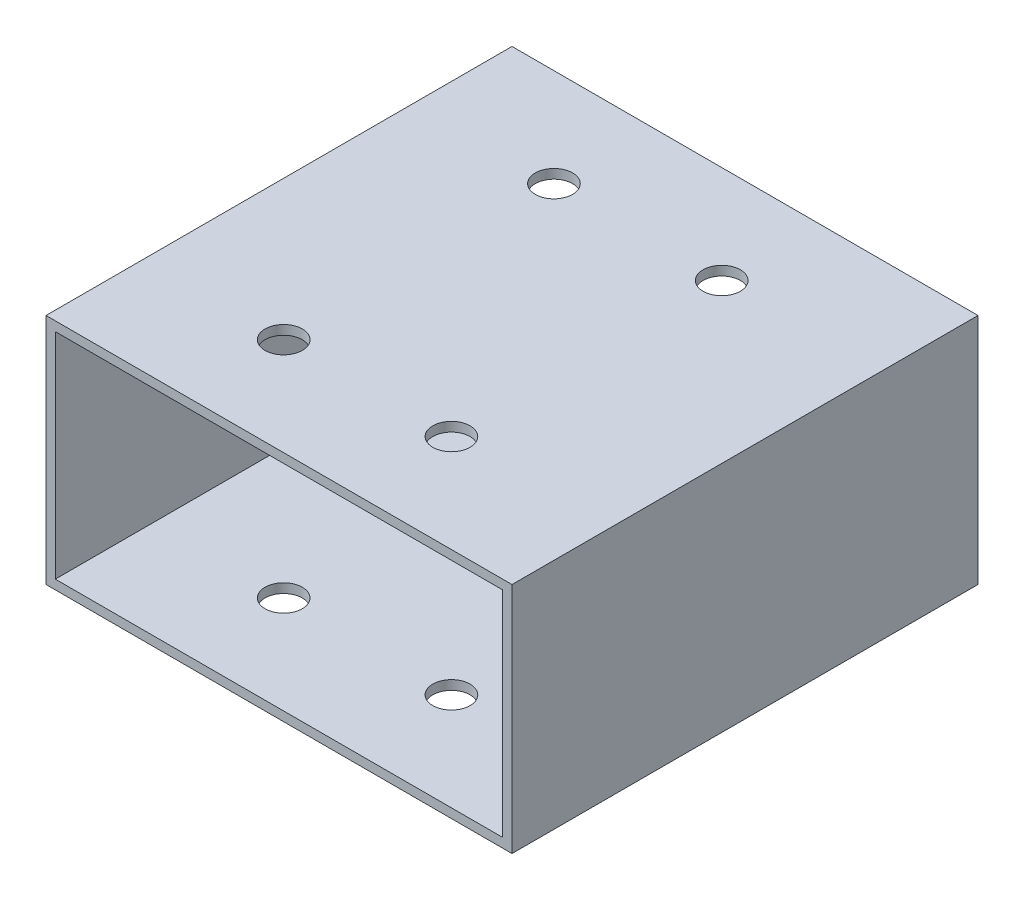
ISO-10303-21;
HEADER;
FILE_DESCRIPTION(('STEP AP214'),'2;1');
FILE_NAME('part.step','',(''),(''),'','','');
FILE_SCHEMA(('AUTOMOTIVE_DESIGN { 1 0 10303 214 1 1 1 1 }'));
ENDSEC;
DATA;
#1=APPLICATION_CONTEXT('core data for automotive mechanical design processes');
#2=APPLICATION_PROTOCOL_DEFINITION('international standard','automotive_design',2000,#1);
#3=PRODUCT_CONTEXT('',#1,'mechanical');
#4=PRODUCT('Part','Part','',(#3));
#5=PRODUCT_RELATED_PRODUCT_CATEGORY('part','',(#4));
#6=PRODUCT_DEFINITION_FORMATION('','',#4);
#7=PRODUCT_DEFINITION_CONTEXT('part definition',#1,'design');
#8=PRODUCT_DEFINITION('design','',#6,#7);
#9=PRODUCT_DEFINITION_SHAPE('','',#8);
#10=(LENGTH_UNIT() NAMED_UNIT(*) SI_UNIT(.MILLI.,.METRE.));
#11=(NAMED_UNIT(*) PLANE_ANGLE_UNIT() SI_UNIT($,.RADIAN.));
#12=(NAMED_UNIT(*) SI_UNIT($,.STERADIAN.) SOLID_ANGLE_UNIT());
#13=UNCERTAINTY_MEASURE_WITH_UNIT(LENGTH_MEASURE(1.E-05),#10,'distance_accuracy_value','');
#14=(GEOMETRIC_REPRESENTATION_CONTEXT(3) GLOBAL_UNCERTAINTY_ASSIGNED_CONTEXT((#13)) GLOBAL_UNIT_ASSIGNED_CONTEXT((#10,
#11,#12)) REPRESENTATION_CONTEXT('',''));
#15=CARTESIAN_POINT('',(0.,0.,0.));
#16=DIRECTION('',(0.,0.,1.));
#17=DIRECTION('',(1.,0.,0.));
#18=AXIS2_PLACEMENT_3D('',#15,#16,#17);
#19=CARTESIAN_POINT('',(0.,0.,50.));
#20=DIRECTION('',(0.,0.,-1.));
#21=DIRECTION('',(-1.,0.,0.));
#22=AXIS2_PLACEMENT_3D('',#19,#20,#21);
#23=PLANE('',#22);
#24=DIRECTION('',(0.,-1.,0.));
#25=VECTOR('',#24,1.);
#26=CARTESIAN_POINT('',(0.,0.,50.));
#27=LINE('',#26,#25);
#28=CARTESIAN_POINT('',(0.,25.,50.));
#29=VERTEX_POINT('',#28);
#30=CARTESIAN_POINT('',(0.,0.,50.));
#31=VERTEX_POINT('',#30);
#32=EDGE_CURVE('E158',#29,#31,#27,.T.);
#33=ORIENTED_EDGE('',*,*,#32,.T.);
#34=DIRECTION('',(1.,0.,0.));
#35=VECTOR('',#34,1.);
#36=CARTESIAN_POINT('',(0.,0.,50.));
#37=LINE('',#36,#35);
#38=CARTESIAN_POINT('',(50.,0.,50.));
#39=VERTEX_POINT('',#38);
#40=EDGE_CURVE('E162',#31,#39,#37,.T.);
#41=ORIENTED_EDGE('',*,*,#40,.T.);
#42=DIRECTION('',(0.,1.,0.));
#43=VECTOR('',#42,1.);
#44=CARTESIAN_POINT('',(50.,0.,50.));
#45=LINE('',#44,#43);
#46=CARTESIAN_POINT('',(50.,25.,50.));
#47=VERTEX_POINT('',#46);
#48=EDGE_CURVE('E166',#39,#47,#45,.T.);
#49=ORIENTED_EDGE('',*,*,#48,.T.);
#50=DIRECTION('',(-1.,0.,0.));
#51=VECTOR('',#50,1.);
#52=CARTESIAN_POINT('',(0.,25.,50.));
#53=LINE('',#52,#51);
#54=EDGE_CURVE('E169',#47,#29,#53,.T.);
#55=ORIENTED_EDGE('',*,*,#54,.T.);
#56=EDGE_LOOP('',(#33,#41,#49,#55));
#57=FACE_BOUND('',#56,.T.);
#58=DIRECTION('',(0.,-1.,0.));
#59=VECTOR('',#58,1.);
#60=CARTESIAN_POINT('',(1.,1.,50.));
#61=LINE('',#60,#59);
#62=CARTESIAN_POINT('',(1.,24.,50.));
#63=VERTEX_POINT('',#62);
#64=CARTESIAN_POINT('',(1.,1.,50.));
#65=VERTEX_POINT('',#64);
#66=EDGE_CURVE('E107',#63,#65,#61,.T.);
#67=ORIENTED_EDGE('',*,*,#66,.F.);
#68=DIRECTION('',(-1.,0.,0.));
#69=VECTOR('',#68,1.);
#70=CARTESIAN_POINT('',(1.,24.,50.));
#71=LINE('',#70,#69);
#72=CARTESIAN_POINT('',(49.,24.,50.));
#73=VERTEX_POINT('',#72);
#74=EDGE_CURVE('E135',#73,#63,#71,.T.);
#75=ORIENTED_EDGE('',*,*,#74,.F.);
#76=DIRECTION('',(0.,1.,0.));
#77=VECTOR('',#76,1.);
#78=CARTESIAN_POINT('',(49.,1.,50.));
#79=LINE('',#78,#77);
#80=CARTESIAN_POINT('',(49.,1.,50.));
#81=VERTEX_POINT('',#80);
#82=EDGE_CURVE('E129',#81,#73,#79,.T.);
#83=ORIENTED_EDGE('',*,*,#82,.F.);
#84=DIRECTION('',(1.,0.,0.));
#85=VECTOR('',#84,1.);
#86=CARTESIAN_POINT('',(1.,1.,50.));
#87=LINE('',#86,#85);
#88=EDGE_CURVE('E116',#65,#81,#87,.T.);
#89=ORIENTED_EDGE('',*,*,#88,.F.);
#90=EDGE_LOOP('',(#67,#75,#83,#89));
#91=FACE_BOUND('',#90,.T.);
#92=ADVANCED_FACE('F39',(#57,#91),#23,.F.);
#93=CARTESIAN_POINT('',(0.,0.,0.));
#94=DIRECTION('',(0.,0.,-1.));
#95=DIRECTION('',(-1.,0.,0.));
#96=AXIS2_PLACEMENT_3D('',#93,#94,#95);
#97=PLANE('',#96);
#98=DIRECTION('',(0.,-1.,0.));
#99=VECTOR('',#98,1.);
#100=CARTESIAN_POINT('',(0.,0.,0.));
#101=LINE('',#100,#99);
#102=CARTESIAN_POINT('',(0.,25.,0.));
#103=VERTEX_POINT('',#102);
#104=CARTESIAN_POINT('',(0.,0.,0.));
#105=VERTEX_POINT('',#104);
#106=EDGE_CURVE('E125',#103,#105,#101,.T.);
#107=ORIENTED_EDGE('',*,*,#106,.F.);
#108=DIRECTION('',(-1.,0.,0.));
#109=VECTOR('',#108,1.);
#110=CARTESIAN_POINT('',(0.,25.,0.));
#111=LINE('',#110,#109);
#112=CARTESIAN_POINT('',(50.,25.,0.));
#113=VERTEX_POINT('',#112);
#114=EDGE_CURVE('E163',#113,#103,#111,.T.);
#115=ORIENTED_EDGE('',*,*,#114,.F.);
#116=DIRECTION('',(0.,1.,0.));
#117=VECTOR('',#116,1.);
#118=CARTESIAN_POINT('',(50.,0.,0.));
#119=LINE('',#118,#117);
#120=CARTESIAN_POINT('',(50.,0.,0.));
#121=VERTEX_POINT('',#120);
#122=EDGE_CURVE('E179',#121,#113,#119,.T.);
#123=ORIENTED_EDGE('',*,*,#122,.F.);
#124=DIRECTION('',(1.,0.,0.));
#125=VECTOR('',#124,1.);
#126=CARTESIAN_POINT('',(0.,0.,0.));
#127=LINE('',#126,#125);
#128=EDGE_CURVE('E176',#105,#121,#127,.T.);
#129=ORIENTED_EDGE('',*,*,#128,.F.);
#130=EDGE_LOOP('',(#107,#115,#123,#129));
#131=FACE_BOUND('',#130,.T.);
#132=DIRECTION('',(-1.,0.,0.));
#133=VECTOR('',#132,1.);
#134=CARTESIAN_POINT('',(1.,24.,0.));
#135=LINE('',#134,#133);
#136=CARTESIAN_POINT('',(49.,24.,0.));
#137=VERTEX_POINT('',#136);
#138=CARTESIAN_POINT('',(1.,24.,0.));
#139=VERTEX_POINT('',#138);
#140=EDGE_CURVE('E117',#137,#139,#135,.T.);
#141=ORIENTED_EDGE('',*,*,#140,.T.);
#142=DIRECTION('',(0.,-1.,0.));
#143=VECTOR('',#142,1.);
#144=CARTESIAN_POINT('',(1.,1.,0.));
#145=LINE('',#144,#143);
#146=CARTESIAN_POINT('',(1.,1.,0.));
#147=VERTEX_POINT('',#146);
#148=EDGE_CURVE('E65',#139,#147,#145,.T.);
#149=ORIENTED_EDGE('',*,*,#148,.T.);
#150=DIRECTION('',(1.,0.,0.));
#151=VECTOR('',#150,1.);
#152=CARTESIAN_POINT('',(1.,1.,0.));
#153=LINE('',#152,#151);
#154=CARTESIAN_POINT('',(49.,1.,0.));
#155=VERTEX_POINT('',#154);
#156=EDGE_CURVE('E123',#147,#155,#153,.T.);
#157=ORIENTED_EDGE('',*,*,#156,.T.);
#158=DIRECTION('',(0.,1.,0.));
#159=VECTOR('',#158,1.);
#160=CARTESIAN_POINT('',(49.,1.,0.));
#161=LINE('',#160,#159);
#162=EDGE_CURVE('E145',#155,#137,#161,.T.);
#163=ORIENTED_EDGE('',*,*,#162,.T.);
#164=EDGE_LOOP('',(#141,#149,#157,#163));
#165=FACE_BOUND('',#164,.T.);
#166=ADVANCED_FACE('F257',(#131,#165),#97,.T.);
#167=CARTESIAN_POINT('',(0.,0.,50.));
#168=DIRECTION('',(1.,0.,0.));
#169=DIRECTION('',(0.,0.,-1.));
#170=AXIS2_PLACEMENT_3D('',#167,#168,#169);
#171=PLANE('',#170);
#172=ORIENTED_EDGE('',*,*,#106,.T.);
#173=DIRECTION('',(0.,0.,-1.));
#174=VECTOR('',#173,1.);
#175=CARTESIAN_POINT('',(0.,0.,50.));
#176=LINE('',#175,#174);
#177=EDGE_CURVE('E11',#31,#105,#176,.T.);
#178=ORIENTED_EDGE('',*,*,#177,.F.);
#179=ORIENTED_EDGE('',*,*,#32,.F.);
#180=DIRECTION('',(0.,0.,-1.));
#181=VECTOR('',#180,1.);
#182=CARTESIAN_POINT('',(0.,25.,50.));
#183=LINE('',#182,#181);
#184=EDGE_CURVE('E172',#29,#103,#183,.T.);
#185=ORIENTED_EDGE('',*,*,#184,.T.);
#186=EDGE_LOOP('',(#172,#178,#179,#185));
#187=FACE_BOUND('',#186,.T.);
#188=ADVANCED_FACE('F41',(#187),#171,.F.);
#189=CARTESIAN_POINT('',(0.,0.,50.));
#190=DIRECTION('',(0.,1.,0.));
#191=DIRECTION('',(0.,0.,1.));
#192=AXIS2_PLACEMENT_3D('',#189,#190,#191);
#193=PLANE('',#192);
#194=CARTESIAN_POINT('',(15.0000000000009,0.,39.5000000000096));
#195=DIRECTION('',(0.,1.,0.));
#196=DIRECTION('',(0.,0.,1.));
#197=AXIS2_PLACEMENT_3D('',#194,#195,#196);
#198=CIRCLE('',#197,2.);
#199=CARTESIAN_POINT('',(15.0000000000009,0.,41.5000000000096));
#200=VERTEX_POINT('',#199);
#201=EDGE_CURVE('E143',#200,#200,#198,.T.);
#202=ORIENTED_EDGE('',*,*,#201,.T.);
#203=EDGE_LOOP('',(#202));
#204=FACE_BOUND('',#203,.T.);
#205=CARTESIAN_POINT('',(33.0000000000009,0.,39.5000000000096));
#206=DIRECTION('',(0.,1.,0.));
#207=DIRECTION('',(0.,0.,1.));
#208=AXIS2_PLACEMENT_3D('',#205,#206,#207);
#209=CIRCLE('',#208,2.);
#210=CARTESIAN_POINT('',(33.0000000000009,0.,41.5000000000096));
#211=VERTEX_POINT('',#210);
#212=EDGE_CURVE('E215',#211,#211,#209,.T.);
#213=ORIENTED_EDGE('',*,*,#212,.T.);
#214=EDGE_LOOP('',(#213));
#215=FACE_BOUND('',#214,.T.);
#216=CARTESIAN_POINT('',(33.0000000000009,0.,10.5000000000096));
#217=DIRECTION('',(0.,1.,0.));
#218=DIRECTION('',(0.,0.,1.));
#219=AXIS2_PLACEMENT_3D('',#216,#217,#218);
#220=CIRCLE('',#219,2.);
#221=CARTESIAN_POINT('',(33.0000000000009,0.,12.5000000000096));
#222=VERTEX_POINT('',#221);
#223=EDGE_CURVE('E209',#222,#222,#220,.T.);
#224=ORIENTED_EDGE('',*,*,#223,.T.);
#225=EDGE_LOOP('',(#224));
#226=FACE_BOUND('',#225,.T.);
#227=CARTESIAN_POINT('',(15.0000000000009,0.,10.5000000000096));
#228=DIRECTION('',(0.,1.,0.));
#229=DIRECTION('',(0.,0.,1.));
#230=AXIS2_PLACEMENT_3D('',#227,#228,#229);
#231=CIRCLE('',#230,2.);
#232=CARTESIAN_POINT('',(15.0000000000009,0.,12.5000000000096));
#233=VERTEX_POINT('',#232);
#234=EDGE_CURVE('E204',#233,#233,#231,.T.);
#235=ORIENTED_EDGE('',*,*,#234,.T.);
#236=EDGE_LOOP('',(#235));
#237=FACE_BOUND('',#236,.T.);
#238=ORIENTED_EDGE('',*,*,#128,.T.);
#239=DIRECTION('',(0.,0.,-1.));
#240=VECTOR('',#239,1.);
#241=CARTESIAN_POINT('',(50.,0.,50.));
#242=LINE('',#241,#240);
#243=EDGE_CURVE('E49',#39,#121,#242,.T.);
#244=ORIENTED_EDGE('',*,*,#243,.F.);
#245=ORIENTED_EDGE('',*,*,#40,.F.);
#246=ORIENTED_EDGE('',*,*,#177,.T.);
#247=EDGE_LOOP('',(#238,#244,#245,#246));
#248=FACE_BOUND('',#247,.T.);
#249=ADVANCED_FACE('F236',(#204,#215,#226,#237,#248),#193,.F.);
#250=CARTESIAN_POINT('',(50.,0.,50.));
#251=DIRECTION('',(-1.,0.,0.));
#252=DIRECTION('',(0.,0.,1.));
#253=AXIS2_PLACEMENT_3D('',#250,#251,#252);
#254=PLANE('',#253);
#255=ORIENTED_EDGE('',*,*,#122,.T.);
#256=DIRECTION('',(0.,0.,-1.));
#257=VECTOR('',#256,1.);
#258=CARTESIAN_POINT('',(50.,25.,50.));
#259=LINE('',#258,#257);
#260=EDGE_CURVE('E187',#47,#113,#259,.T.);
#261=ORIENTED_EDGE('',*,*,#260,.F.);
#262=ORIENTED_EDGE('',*,*,#48,.F.);
#263=ORIENTED_EDGE('',*,*,#243,.T.);
#264=EDGE_LOOP('',(#255,#261,#262,#263));
#265=FACE_BOUND('',#264,.T.);
#266=ADVANCED_FACE('F271',(#265),#254,.F.);
#267=CARTESIAN_POINT('',(0.,25.,50.));
#268=DIRECTION('',(0.,-1.,0.));
#269=DIRECTION('',(0.,0.,-1.));
#270=AXIS2_PLACEMENT_3D('',#267,#268,#269);
#271=PLANE('',#270);
#272=CARTESIAN_POINT('',(15.0000000000009,25.,39.5000000000096));
#273=DIRECTION('',(0.,1.,0.));
#274=DIRECTION('',(0.,0.,1.));
#275=AXIS2_PLACEMENT_3D('',#272,#273,#274);
#276=CIRCLE('',#275,2.);
#277=CARTESIAN_POINT('',(15.0000000000009,25.,41.5000000000096));
#278=VERTEX_POINT('',#277);
#279=EDGE_CURVE('E334',#278,#278,#276,.T.);
#280=ORIENTED_EDGE('',*,*,#279,.F.);
#281=EDGE_LOOP('',(#280));
#282=FACE_BOUND('',#281,.T.);
#283=CARTESIAN_POINT('',(33.0000000000009,25.,39.5000000000096));
#284=DIRECTION('',(0.,1.,0.));
#285=DIRECTION('',(0.,0.,1.));
#286=AXIS2_PLACEMENT_3D('',#283,#284,#285);
#287=CIRCLE('',#286,2.);
#288=CARTESIAN_POINT('',(33.0000000000009,25.,41.5000000000096));
#289=VERTEX_POINT('',#288);
#290=EDGE_CURVE('E338',#289,#289,#287,.T.);
#291=ORIENTED_EDGE('',*,*,#290,.F.);
#292=EDGE_LOOP('',(#291));
#293=FACE_BOUND('',#292,.T.);
#294=CARTESIAN_POINT('',(33.0000000000009,25.,10.5000000000096));
#295=DIRECTION('',(0.,1.,0.));
#296=DIRECTION('',(0.,0.,1.));
#297=AXIS2_PLACEMENT_3D('',#294,#295,#296);
#298=CIRCLE('',#297,2.);
#299=CARTESIAN_POINT('',(33.0000000000009,25.,12.5000000000096));
#300=VERTEX_POINT('',#299);
#301=EDGE_CURVE('E333',#300,#300,#298,.T.);
#302=ORIENTED_EDGE('',*,*,#301,.F.);
#303=EDGE_LOOP('',(#302));
#304=FACE_BOUND('',#303,.T.);
#305=CARTESIAN_POINT('',(15.0000000000009,25.,10.5000000000096));
#306=DIRECTION('',(0.,1.,0.));
#307=DIRECTION('',(0.,0.,1.));
#308=AXIS2_PLACEMENT_3D('',#305,#306,#307);
#309=CIRCLE('',#308,2.);
#310=CARTESIAN_POINT('',(15.0000000000009,25.,12.5000000000096));
#311=VERTEX_POINT('',#310);
#312=EDGE_CURVE('E199',#311,#311,#309,.T.);
#313=ORIENTED_EDGE('',*,*,#312,.F.);
#314=EDGE_LOOP('',(#313));
#315=FACE_BOUND('',#314,.T.);
#316=ORIENTED_EDGE('',*,*,#114,.T.);
#317=ORIENTED_EDGE('',*,*,#184,.F.);
#318=ORIENTED_EDGE('',*,*,#54,.F.);
#319=ORIENTED_EDGE('',*,*,#260,.T.);
#320=EDGE_LOOP('',(#316,#317,#318,#319));
#321=FACE_BOUND('',#320,.T.);
#322=ADVANCED_FACE('F268',(#282,#293,#304,#315,#321),#271,.F.);
#323=CARTESIAN_POINT('',(1.,1.,50.));
#324=DIRECTION('',(1.,0.,0.));
#325=DIRECTION('',(0.,0.,-1.));
#326=AXIS2_PLACEMENT_3D('',#323,#324,#325);
#327=PLANE('',#326);
#328=ORIENTED_EDGE('',*,*,#148,.F.);
#329=DIRECTION('',(0.,0.,-1.));
#330=VECTOR('',#329,1.);
#331=CARTESIAN_POINT('',(1.,24.,50.));
#332=LINE('',#331,#330);
#333=EDGE_CURVE('E111',#63,#139,#332,.T.);
#334=ORIENTED_EDGE('',*,*,#333,.F.);
#335=ORIENTED_EDGE('',*,*,#66,.T.);
#336=DIRECTION('',(0.,0.,-1.));
#337=VECTOR('',#336,1.);
#338=CARTESIAN_POINT('',(1.,1.,50.));
#339=LINE('',#338,#337);
#340=EDGE_CURVE('E110',#65,#147,#339,.T.);
#341=ORIENTED_EDGE('',*,*,#340,.T.);
#342=EDGE_LOOP('',(#328,#334,#335,#341));
#343=FACE_BOUND('',#342,.T.);
#344=ADVANCED_FACE('F109',(#343),#327,.T.);
#345=CARTESIAN_POINT('',(1.,1.,50.));
#346=DIRECTION('',(0.,1.,0.));
#347=DIRECTION('',(0.,0.,1.));
#348=AXIS2_PLACEMENT_3D('',#345,#346,#347);
#349=PLANE('',#348);
#350=CARTESIAN_POINT('',(15.0000000000009,1.,39.5000000000096));
#351=DIRECTION('',(0.,1.,0.));
#352=DIRECTION('',(0.,0.,1.));
#353=AXIS2_PLACEMENT_3D('',#350,#351,#352);
#354=CIRCLE('',#353,2.);
#355=CARTESIAN_POINT('',(15.0000000000009,1.,41.5000000000096));
#356=VERTEX_POINT('',#355);
#357=EDGE_CURVE('E229',#356,#356,#354,.T.);
#358=ORIENTED_EDGE('',*,*,#357,.F.);
#359=EDGE_LOOP('',(#358));
#360=FACE_BOUND('',#359,.T.);
#361=CARTESIAN_POINT('',(33.0000000000009,1.,39.5000000000096));
#362=DIRECTION('',(0.,1.,0.));
#363=DIRECTION('',(0.,0.,1.));
#364=AXIS2_PLACEMENT_3D('',#361,#362,#363);
#365=CIRCLE('',#364,2.);
#366=CARTESIAN_POINT('',(33.0000000000009,1.,41.5000000000096));
#367=VERTEX_POINT('',#366);
#368=EDGE_CURVE('E208',#367,#367,#365,.T.);
#369=ORIENTED_EDGE('',*,*,#368,.F.);
#370=EDGE_LOOP('',(#369));
#371=FACE_BOUND('',#370,.T.);
#372=CARTESIAN_POINT('',(33.0000000000009,1.,10.5000000000096));
#373=DIRECTION('',(0.,1.,0.));
#374=DIRECTION('',(0.,0.,1.));
#375=AXIS2_PLACEMENT_3D('',#372,#373,#374);
#376=CIRCLE('',#375,2.);
#377=CARTESIAN_POINT('',(33.0000000000009,1.,12.5000000000096));
#378=VERTEX_POINT('',#377);
#379=EDGE_CURVE('E203',#378,#378,#376,.T.);
#380=ORIENTED_EDGE('',*,*,#379,.F.);
#381=EDGE_LOOP('',(#380));
#382=FACE_BOUND('',#381,.T.);
#383=CARTESIAN_POINT('',(15.0000000000009,1.,10.5000000000096));
#384=DIRECTION('',(0.,1.,0.));
#385=DIRECTION('',(0.,0.,1.));
#386=AXIS2_PLACEMENT_3D('',#383,#384,#385);
#387=CIRCLE('',#386,2.);
#388=CARTESIAN_POINT('',(15.0000000000009,1.,12.5000000000096));
#389=VERTEX_POINT('',#388);
#390=EDGE_CURVE('E198',#389,#389,#387,.T.);
#391=ORIENTED_EDGE('',*,*,#390,.F.);
#392=EDGE_LOOP('',(#391));
#393=FACE_BOUND('',#392,.T.);
#394=ORIENTED_EDGE('',*,*,#156,.F.);
#395=ORIENTED_EDGE('',*,*,#340,.F.);
#396=ORIENTED_EDGE('',*,*,#88,.T.);
#397=DIRECTION('',(0.,0.,-1.));
#398=VECTOR('',#397,1.);
#399=CARTESIAN_POINT('',(49.,1.,50.));
#400=LINE('',#399,#398);
#401=EDGE_CURVE('E126',#81,#155,#400,.T.);
#402=ORIENTED_EDGE('',*,*,#401,.T.);
#403=EDGE_LOOP('',(#394,#395,#396,#402));
#404=FACE_BOUND('',#403,.T.);
#405=ADVANCED_FACE('F120',(#360,#371,#382,#393,#404),#349,.T.);
#406=CARTESIAN_POINT('',(49.,1.,50.));
#407=DIRECTION('',(-1.,0.,0.));
#408=DIRECTION('',(0.,0.,1.));
#409=AXIS2_PLACEMENT_3D('',#406,#407,#408);
#410=PLANE('',#409);
#411=ORIENTED_EDGE('',*,*,#162,.F.);
#412=ORIENTED_EDGE('',*,*,#401,.F.);
#413=ORIENTED_EDGE('',*,*,#82,.T.);
#414=DIRECTION('',(0.,0.,-1.));
#415=VECTOR('',#414,1.);
#416=CARTESIAN_POINT('',(49.,24.,50.));
#417=LINE('',#416,#415);
#418=EDGE_CURVE('E57',#73,#137,#417,.T.);
#419=ORIENTED_EDGE('',*,*,#418,.T.);
#420=EDGE_LOOP('',(#411,#412,#413,#419));
#421=FACE_BOUND('',#420,.T.);
#422=ADVANCED_FACE('F299',(#421),#410,.T.);
#423=CARTESIAN_POINT('',(1.,24.,50.));
#424=DIRECTION('',(0.,-1.,0.));
#425=DIRECTION('',(0.,0.,-1.));
#426=AXIS2_PLACEMENT_3D('',#423,#424,#425);
#427=PLANE('',#426);
#428=CARTESIAN_POINT('',(15.0000000000009,24.,39.5000000000096));
#429=DIRECTION('',(0.,-1.,0.));
#430=DIRECTION('',(0.,0.,-1.));
#431=AXIS2_PLACEMENT_3D('',#428,#429,#430);
#432=CIRCLE('',#431,2.);
#433=CARTESIAN_POINT('',(15.0000000000009,24.,37.5000000000096));
#434=VERTEX_POINT('',#433);
#435=EDGE_CURVE('E43',#434,#434,#432,.T.);
#436=ORIENTED_EDGE('',*,*,#435,.F.);
#437=EDGE_LOOP('',(#436));
#438=FACE_BOUND('',#437,.T.);
#439=CARTESIAN_POINT('',(33.0000000000009,24.,39.5000000000096));
#440=DIRECTION('',(0.,-1.,0.));
#441=DIRECTION('',(0.,0.,-1.));
#442=AXIS2_PLACEMENT_3D('',#439,#440,#441);
#443=CIRCLE('',#442,2.);
#444=CARTESIAN_POINT('',(33.0000000000009,24.,37.5000000000096));
#445=VERTEX_POINT('',#444);
#446=EDGE_CURVE('E205',#445,#445,#443,.T.);
#447=ORIENTED_EDGE('',*,*,#446,.F.);
#448=EDGE_LOOP('',(#447));
#449=FACE_BOUND('',#448,.T.);
#450=CARTESIAN_POINT('',(33.0000000000009,24.,10.5000000000096));
#451=DIRECTION('',(0.,-1.,0.));
#452=DIRECTION('',(0.,0.,-1.));
#453=AXIS2_PLACEMENT_3D('',#450,#451,#452);
#454=CIRCLE('',#453,2.);
#455=CARTESIAN_POINT('',(33.0000000000009,24.,8.50000000000958));
#456=VERTEX_POINT('',#455);
#457=EDGE_CURVE('E200',#456,#456,#454,.T.);
#458=ORIENTED_EDGE('',*,*,#457,.F.);
#459=EDGE_LOOP('',(#458));
#460=FACE_BOUND('',#459,.T.);
#461=CARTESIAN_POINT('',(15.0000000000009,24.,10.5000000000096));
#462=DIRECTION('',(0.,-1.,0.));
#463=DIRECTION('',(0.,0.,-1.));
#464=AXIS2_PLACEMENT_3D('',#461,#462,#463);
#465=CIRCLE('',#464,2.);
#466=CARTESIAN_POINT('',(15.0000000000009,24.,8.50000000000958));
#467=VERTEX_POINT('',#466);
#468=EDGE_CURVE('E194',#467,#467,#465,.T.);
#469=ORIENTED_EDGE('',*,*,#468,.F.);
#470=EDGE_LOOP('',(#469));
#471=FACE_BOUND('',#470,.T.);
#472=ORIENTED_EDGE('',*,*,#140,.F.);
#473=ORIENTED_EDGE('',*,*,#418,.F.);
#474=ORIENTED_EDGE('',*,*,#74,.T.);
#475=ORIENTED_EDGE('',*,*,#333,.T.);
#476=EDGE_LOOP('',(#472,#473,#474,#475));
#477=FACE_BOUND('',#476,.T.);
#478=ADVANCED_FACE('F296',(#438,#449,#460,#471,#477),#427,.T.);
#479=CARTESIAN_POINT('',(15.0000000000009,-25.,10.5000000000096));
#480=DIRECTION('',(0.,1.,0.));
#481=DIRECTION('',(0.,0.,1.));
#482=AXIS2_PLACEMENT_3D('',#479,#480,#481);
#483=CYLINDRICAL_SURFACE('',#482,2.);
#484=ORIENTED_EDGE('',*,*,#468,.T.);
#485=EDGE_LOOP('',(#484));
#486=FACE_BOUND('',#485,.T.);
#487=ORIENTED_EDGE('',*,*,#312,.T.);
#488=EDGE_LOOP('',(#487));
#489=FACE_BOUND('',#488,.T.);
#490=ADVANCED_FACE('F298',(#486,#489),#483,.F.);
#491=CARTESIAN_POINT('',(33.0000000000009,-25.,10.5000000000096));
#492=DIRECTION('',(0.,1.,0.));
#493=DIRECTION('',(0.,0.,1.));
#494=AXIS2_PLACEMENT_3D('',#491,#492,#493);
#495=CYLINDRICAL_SURFACE('',#494,2.);
#496=ORIENTED_EDGE('',*,*,#457,.T.);
#497=EDGE_LOOP('',(#496));
#498=FACE_BOUND('',#497,.T.);
#499=ORIENTED_EDGE('',*,*,#301,.T.);
#500=EDGE_LOOP('',(#499));
#501=FACE_BOUND('',#500,.T.);
#502=ADVANCED_FACE('F306',(#498,#501),#495,.F.);
#503=CARTESIAN_POINT('',(33.0000000000009,-25.,39.5000000000096));
#504=DIRECTION('',(0.,1.,0.));
#505=DIRECTION('',(0.,0.,1.));
#506=AXIS2_PLACEMENT_3D('',#503,#504,#505);
#507=CYLINDRICAL_SURFACE('',#506,2.);
#508=ORIENTED_EDGE('',*,*,#446,.T.);
#509=EDGE_LOOP('',(#508));
#510=FACE_BOUND('',#509,.T.);
#511=ORIENTED_EDGE('',*,*,#290,.T.);
#512=EDGE_LOOP('',(#511));
#513=FACE_BOUND('',#512,.T.);
#514=ADVANCED_FACE('F251',(#510,#513),#507,.F.);
#515=CARTESIAN_POINT('',(15.0000000000009,-25.,39.5000000000096));
#516=DIRECTION('',(0.,1.,0.));
#517=DIRECTION('',(0.,0.,1.));
#518=AXIS2_PLACEMENT_3D('',#515,#516,#517);
#519=CYLINDRICAL_SURFACE('',#518,2.);
#520=ORIENTED_EDGE('',*,*,#435,.T.);
#521=EDGE_LOOP('',(#520));
#522=FACE_BOUND('',#521,.T.);
#523=ORIENTED_EDGE('',*,*,#279,.T.);
#524=EDGE_LOOP('',(#523));
#525=FACE_BOUND('',#524,.T.);
#526=ADVANCED_FACE('F244',(#522,#525),#519,.F.);
#527=ORIENTED_EDGE('',*,*,#390,.T.);
#528=EDGE_LOOP('',(#527));
#529=FACE_BOUND('',#528,.T.);
#530=ORIENTED_EDGE('',*,*,#234,.F.);
#531=EDGE_LOOP('',(#530));
#532=FACE_BOUND('',#531,.T.);
#533=ADVANCED_FACE('F254',(#529,#532),#483,.F.);
#534=ORIENTED_EDGE('',*,*,#379,.T.);
#535=EDGE_LOOP('',(#534));
#536=FACE_BOUND('',#535,.T.);
#537=ORIENTED_EDGE('',*,*,#223,.F.);
#538=EDGE_LOOP('',(#537));
#539=FACE_BOUND('',#538,.T.);
#540=ADVANCED_FACE('F248',(#536,#539),#495,.F.);
#541=ORIENTED_EDGE('',*,*,#368,.T.);
#542=EDGE_LOOP('',(#541));
#543=FACE_BOUND('',#542,.T.);
#544=ORIENTED_EDGE('',*,*,#212,.F.);
#545=EDGE_LOOP('',(#544));
#546=FACE_BOUND('',#545,.T.);
#547=ADVANCED_FACE('F241',(#543,#546),#507,.F.);
#548=ORIENTED_EDGE('',*,*,#357,.T.);
#549=EDGE_LOOP('',(#548));
#550=FACE_BOUND('',#549,.T.);
#551=ORIENTED_EDGE('',*,*,#201,.F.);
#552=EDGE_LOOP('',(#551));
#553=FACE_BOUND('',#552,.T.);
#554=ADVANCED_FACE('F239',(#550,#553),#519,.F.);
#555=CLOSED_SHELL('',(#92,#166,#188,#249,#266,#322,#344,#405,#422,#478,#490,#502,#514,#526,#533,
#540,#547,#554));
#556=MANIFOLD_SOLID_BREP('B2',#555);
#557=ADVANCED_BREP_SHAPE_REPRESENTATION('',(#18,#556),#14);
#558=SHAPE_DEFINITION_REPRESENTATION(#9,#557);
ENDSEC;
END-ISO-10303-21;
